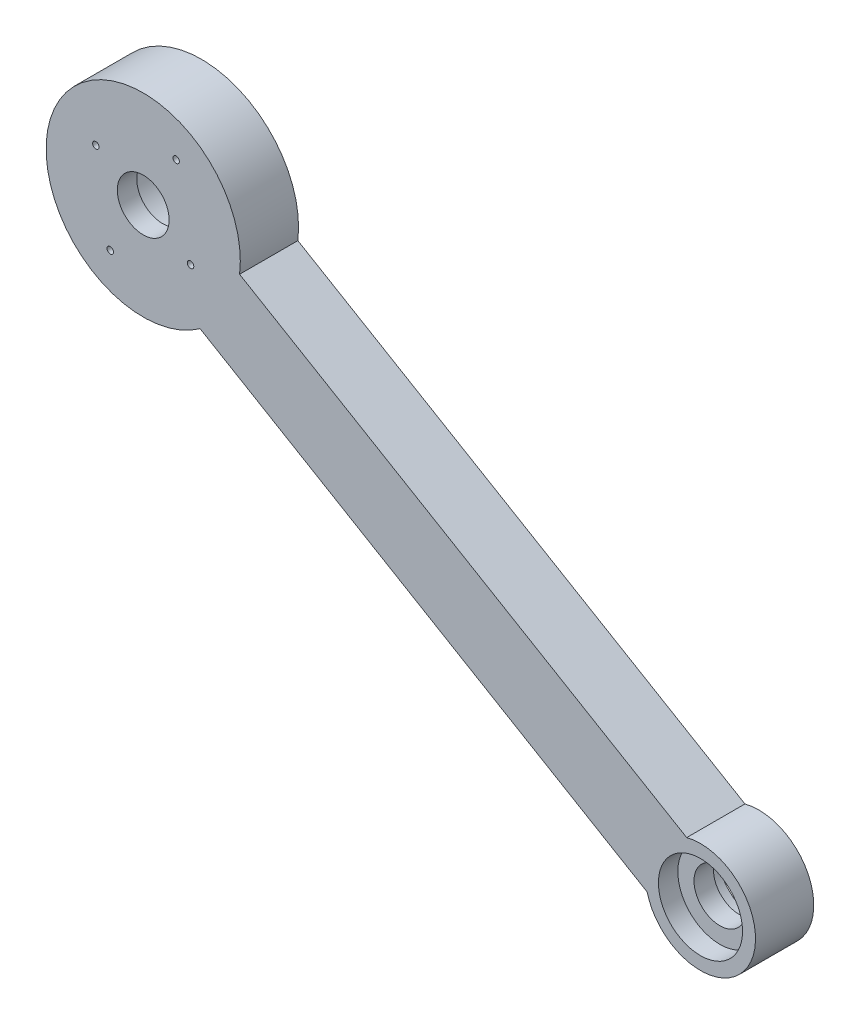
ISO-10303-21;
HEADER;
FILE_DESCRIPTION(('STEP AP214'),'2;1');
FILE_NAME('part.step','',(''),(''),'','','');
FILE_SCHEMA(('AUTOMOTIVE_DESIGN { 1 0 10303 214 1 1 1 1 }'));
ENDSEC;
DATA;
#1=APPLICATION_CONTEXT('core data for automotive mechanical design processes');
#2=APPLICATION_PROTOCOL_DEFINITION('international standard','automotive_design',2000,#1);
#3=PRODUCT_CONTEXT('',#1,'mechanical');
#4=PRODUCT('Part','Part','',(#3));
#5=PRODUCT_RELATED_PRODUCT_CATEGORY('part','',(#4));
#6=PRODUCT_DEFINITION_FORMATION('','',#4);
#7=PRODUCT_DEFINITION_CONTEXT('part definition',#1,'design');
#8=PRODUCT_DEFINITION('design','',#6,#7);
#9=PRODUCT_DEFINITION_SHAPE('','',#8);
#10=(LENGTH_UNIT() NAMED_UNIT(*) SI_UNIT(.MILLI.,.METRE.));
#11=(NAMED_UNIT(*) PLANE_ANGLE_UNIT() SI_UNIT($,.RADIAN.));
#12=(NAMED_UNIT(*) SI_UNIT($,.STERADIAN.) SOLID_ANGLE_UNIT());
#13=UNCERTAINTY_MEASURE_WITH_UNIT(LENGTH_MEASURE(1.E-05),#10,'distance_accuracy_value','');
#14=(GEOMETRIC_REPRESENTATION_CONTEXT(3) GLOBAL_UNCERTAINTY_ASSIGNED_CONTEXT((#13)) GLOBAL_UNIT_ASSIGNED_CONTEXT((#10,
#11,#12)) REPRESENTATION_CONTEXT('',''));
#15=CARTESIAN_POINT('',(0.,0.,0.));
#16=DIRECTION('',(0.,0.,1.));
#17=DIRECTION('',(1.,0.,0.));
#18=AXIS2_PLACEMENT_3D('',#15,#16,#17);
#19=CARTESIAN_POINT('',(79.4021009259185,-60.110986977048,4.5000000000001));
#20=DIRECTION('',(0.,0.,-1.));
#21=DIRECTION('',(0.,1.,0.));
#22=AXIS2_PLACEMENT_3D('',#19,#20,#21);
#23=CYLINDRICAL_SURFACE('',#22,6.49999999999999);
#24=CARTESIAN_POINT('',(79.4021009259185,-60.110986977048,-4.49999999999989));
#25=DIRECTION('',(0.,0.,1.));
#26=DIRECTION('',(0.,-1.,0.));
#27=AXIS2_PLACEMENT_3D('',#24,#25,#26);
#28=CIRCLE('',#27,6.49999999999999);
#29=CARTESIAN_POINT('',(79.4021009259185,-66.610986977048,-4.4999999999999));
#30=VERTEX_POINT('',#29);
#31=EDGE_CURVE('E228',#30,#30,#28,.T.);
#32=ORIENTED_EDGE('',*,*,#31,.F.);
#33=EDGE_LOOP('',(#32));
#34=FACE_BOUND('',#33,.T.);
#35=CARTESIAN_POINT('',(79.4021009259185,-60.110986977048,-1.49999999999989));
#36=DIRECTION('',(0.,0.,1.));
#37=DIRECTION('',(0.,-1.,0.));
#38=AXIS2_PLACEMENT_3D('',#35,#36,#37);
#39=CIRCLE('',#38,6.49999999999999);
#40=CARTESIAN_POINT('',(79.4021009259185,-66.610986977048,-1.4999999999999));
#41=VERTEX_POINT('',#40);
#42=EDGE_CURVE('E246',#41,#41,#39,.T.);
#43=ORIENTED_EDGE('',*,*,#42,.T.);
#44=EDGE_LOOP('',(#43));
#45=FACE_BOUND('',#44,.T.);
#46=ADVANCED_FACE('F59',(#34,#45),#23,.F.);
#47=CARTESIAN_POINT('',(-6.68402934790152,-9.22701922217562,4.50000000000011));
#48=DIRECTION('',(0.,0.,-1.));
#49=DIRECTION('',(0.,1.,0.));
#50=AXIS2_PLACEMENT_3D('',#47,#48,#49);
#51=CYLINDRICAL_SURFACE('',#50,6.49999999999999);
#52=CARTESIAN_POINT('',(-6.68402934790152,-9.22701922217561,-4.49999999999989));
#53=DIRECTION('',(0.,0.,1.));
#54=DIRECTION('',(0.,-1.,0.));
#55=AXIS2_PLACEMENT_3D('',#52,#53,#54);
#56=CIRCLE('',#55,6.49999999999999);
#57=CARTESIAN_POINT('',(-6.68402934790152,-15.7270192221756,-4.49999999999989));
#58=VERTEX_POINT('',#57);
#59=EDGE_CURVE('E148',#58,#58,#56,.T.);
#60=ORIENTED_EDGE('',*,*,#59,.F.);
#61=EDGE_LOOP('',(#60));
#62=FACE_BOUND('',#61,.T.);
#63=CARTESIAN_POINT('',(-6.68402934790152,-9.22701922217561,1.50000000000011));
#64=DIRECTION('',(0.,0.,1.));
#65=DIRECTION('',(0.,-1.,0.));
#66=AXIS2_PLACEMENT_3D('',#63,#64,#65);
#67=CIRCLE('',#66,6.49999999999999);
#68=CARTESIAN_POINT('',(-6.68402934790152,-15.7270192221756,1.50000000000011));
#69=VERTEX_POINT('',#68);
#70=EDGE_CURVE('E226',#69,#69,#67,.T.);
#71=ORIENTED_EDGE('',*,*,#70,.T.);
#72=EDGE_LOOP('',(#71));
#73=FACE_BOUND('',#72,.T.);
#74=ADVANCED_FACE('F186',(#62,#73),#51,.F.);
#75=CARTESIAN_POINT('',(0.,0.,4.50000000000011));
#76=DIRECTION('',(0.,0.,1.));
#77=DIRECTION('',(0.,-1.,0.));
#78=AXIS2_PLACEMENT_3D('',#75,#76,#77);
#79=PLANE('',#78);
#80=CARTESIAN_POINT('',(-11.7724261233886,-17.8356322495575,4.50000000000011));
#81=DIRECTION('',(0.,0.,1.));
#82=DIRECTION('',(0.,-1.,0.));
#83=AXIS2_PLACEMENT_3D('',#80,#81,#82);
#84=CIRCLE('',#83,0.500000000000026);
#85=CARTESIAN_POINT('',(-11.7724261233886,-18.3356322495576,4.50000000000011));
#86=VERTEX_POINT('',#85);
#87=EDGE_CURVE('E137',#86,#86,#84,.F.);
#88=ORIENTED_EDGE('',*,*,#87,.T.);
#89=EDGE_LOOP('',(#88));
#90=FACE_BOUND('',#89,.T.);
#91=CARTESIAN_POINT('',(-1.59563257241419,-0.618406194793586,4.50000000000011));
#92=DIRECTION('',(0.,0.,1.));
#93=DIRECTION('',(0.,-1.,0.));
#94=AXIS2_PLACEMENT_3D('',#91,#92,#93);
#95=CIRCLE('',#94,0.499999999999975);
#96=CARTESIAN_POINT('',(-1.59563257241419,-1.11840619479356,4.50000000000011));
#97=VERTEX_POINT('',#96);
#98=EDGE_CURVE('E134',#97,#97,#95,.T.);
#99=ORIENTED_EDGE('',*,*,#98,.F.);
#100=EDGE_LOOP('',(#99));
#101=FACE_BOUND('',#100,.T.);
#102=CARTESIAN_POINT('',(0.633291725373242,-13.5521564813397,4.50000000000011));
#103=DIRECTION('',(0.,0.,1.));
#104=DIRECTION('',(0.,-1.,0.));
#105=AXIS2_PLACEMENT_3D('',#102,#103,#104);
#106=CIRCLE('',#105,0.500000000000026);
#107=CARTESIAN_POINT('',(0.633291725373242,-14.0521564813397,4.50000000000011));
#108=VERTEX_POINT('',#107);
#109=EDGE_CURVE('E131',#108,#108,#106,.T.);
#110=ORIENTED_EDGE('',*,*,#109,.F.);
#111=EDGE_LOOP('',(#110));
#112=FACE_BOUND('',#111,.T.);
#113=CARTESIAN_POINT('',(-14.0013504211761,-4.90188196301145,4.50000000000011));
#114=DIRECTION('',(0.,0.,1.));
#115=DIRECTION('',(0.,-1.,0.));
#116=AXIS2_PLACEMENT_3D('',#113,#114,#115);
#117=CIRCLE('',#116,0.500000000000026);
#118=CARTESIAN_POINT('',(-14.0013504211761,-5.40188196301147,4.50000000000011));
#119=VERTEX_POINT('',#118);
#120=EDGE_CURVE('E128',#119,#119,#117,.F.);
#121=ORIENTED_EDGE('',*,*,#120,.T.);
#122=EDGE_LOOP('',(#121));
#123=FACE_BOUND('',#122,.T.);
#124=DIRECTION('',(0.860861302738201,-0.508839677548722,0.));
#125=VECTOR('',#124,1.);
#126=CARTESIAN_POINT('',(-2.7193833026163,-4.60068653414046,4.50000000000011));
#127=LINE('',#126,#125);
#128=CARTESIAN_POINT('',(8.20389496535909,-11.0572404226382,4.50000000000011));
#129=VERTEX_POINT('',#128);
#130=CARTESIAN_POINT('',(77.2720675931386,-51.8821986092961,4.50000000000011));
#131=VERTEX_POINT('',#130);
#132=EDGE_CURVE('E121',#129,#131,#127,.T.);
#133=ORIENTED_EDGE('',*,*,#132,.F.);
#134=CARTESIAN_POINT('',(-6.68402934790152,-9.22701922217562,4.50000000000011));
#135=DIRECTION('',(0.,0.,1.));
#136=DIRECTION('',(0.,-1.,0.));
#137=AXIS2_PLACEMENT_3D('',#134,#135,#136);
#138=CIRCLE('',#137,15.);
#139=CARTESIAN_POINT('',(2.09781883477449,-21.3875760554966,4.50000000000011));
#140=VERTEX_POINT('',#139);
#141=EDGE_CURVE('E111',#140,#129,#138,.F.);
#142=ORIENTED_EDGE('',*,*,#141,.F.);
#143=DIRECTION('',(0.860861302738201,-0.508839677548723,0.));
#144=VECTOR('',#143,1.);
#145=CARTESIAN_POINT('',(-8.82545943320096,-14.9310221669988,4.50000000000011));
#146=LINE('',#145,#144);
#147=CARTESIAN_POINT('',(71.1659914625539,-62.2125342421545,4.5000000000001));
#148=VERTEX_POINT('',#147);
#149=EDGE_CURVE('E116',#140,#148,#146,.T.);
#150=ORIENTED_EDGE('',*,*,#149,.T.);
#151=CARTESIAN_POINT('',(79.4021009259185,-60.110986977048,4.5000000000001));
#152=DIRECTION('',(0.,0.,1.));
#153=DIRECTION('',(0.,-1.,0.));
#154=AXIS2_PLACEMENT_3D('',#151,#152,#153);
#155=CIRCLE('',#154,8.50000000000004);
#156=EDGE_CURVE('E76',#148,#131,#155,.T.);
#157=ORIENTED_EDGE('',*,*,#156,.T.);
#158=EDGE_LOOP('',(#133,#142,#150,#157));
#159=FACE_BOUND('',#158,.T.);
#160=CARTESIAN_POINT('',(79.4021009259185,-60.110986977048,4.5000000000001));
#161=DIRECTION('',(0.,0.,1.));
#162=DIRECTION('',(0.,-1.,0.));
#163=AXIS2_PLACEMENT_3D('',#160,#161,#162);
#164=CIRCLE('',#163,6.49999999999999);
#165=CARTESIAN_POINT('',(79.4021009259185,-66.610986977048,4.5000000000001));
#166=VERTEX_POINT('',#165);
#167=EDGE_CURVE('E143',#166,#166,#164,.T.);
#168=ORIENTED_EDGE('',*,*,#167,.F.);
#169=EDGE_LOOP('',(#168));
#170=FACE_BOUND('',#169,.T.);
#171=CARTESIAN_POINT('',(-6.68402934790152,-9.22701922217561,4.50000000000011));
#172=DIRECTION('',(0.,0.,1.));
#173=DIRECTION('',(0.,-1.,0.));
#174=AXIS2_PLACEMENT_3D('',#171,#172,#173);
#175=CIRCLE('',#174,4.00000000000003);
#176=CARTESIAN_POINT('',(-6.68402934790152,-13.2270192221756,4.50000000000011));
#177=VERTEX_POINT('',#176);
#178=EDGE_CURVE('E233',#177,#177,#175,.T.);
#179=ORIENTED_EDGE('',*,*,#178,.F.);
#180=EDGE_LOOP('',(#179));
#181=FACE_BOUND('',#180,.T.);
#182=ADVANCED_FACE('F119',(#90,#101,#112,#123,#159,#170,#181),#79,.T.);
#183=CARTESIAN_POINT('',(0.,0.,-4.49999999999989));
#184=DIRECTION('',(0.,0.,1.));
#185=DIRECTION('',(0.,-1.,0.));
#186=AXIS2_PLACEMENT_3D('',#183,#184,#185);
#187=PLANE('',#186);
#188=CARTESIAN_POINT('',(-11.7724261233886,-17.8356322495575,-4.49999999999989));
#189=DIRECTION('',(0.,0.,1.));
#190=DIRECTION('',(0.,-1.,0.));
#191=AXIS2_PLACEMENT_3D('',#188,#189,#190);
#192=CIRCLE('',#191,0.500000000000026);
#193=CARTESIAN_POINT('',(-11.7724261233886,-18.3356322495576,-4.49999999999989));
#194=VERTEX_POINT('',#193);
#195=EDGE_CURVE('E123',#194,#194,#192,.F.);
#196=ORIENTED_EDGE('',*,*,#195,.F.);
#197=EDGE_LOOP('',(#196));
#198=FACE_BOUND('',#197,.T.);
#199=CARTESIAN_POINT('',(-1.59563257241418,-0.618406194793585,-4.49999999999989));
#200=DIRECTION('',(0.,0.,1.));
#201=DIRECTION('',(0.,-1.,0.));
#202=AXIS2_PLACEMENT_3D('',#199,#200,#201);
#203=CIRCLE('',#202,0.499999999999975);
#204=CARTESIAN_POINT('',(-1.59563257241418,-1.11840619479356,-4.49999999999989));
#205=VERTEX_POINT('',#204);
#206=EDGE_CURVE('E157',#205,#205,#203,.T.);
#207=ORIENTED_EDGE('',*,*,#206,.T.);
#208=EDGE_LOOP('',(#207));
#209=FACE_BOUND('',#208,.T.);
#210=CARTESIAN_POINT('',(0.633291725373242,-13.5521564813397,-4.49999999999989));
#211=DIRECTION('',(0.,0.,1.));
#212=DIRECTION('',(0.,-1.,0.));
#213=AXIS2_PLACEMENT_3D('',#210,#211,#212);
#214=CIRCLE('',#213,0.500000000000026);
#215=CARTESIAN_POINT('',(0.633291725373242,-14.0521564813397,-4.49999999999989));
#216=VERTEX_POINT('',#215);
#217=EDGE_CURVE('E154',#216,#216,#214,.T.);
#218=ORIENTED_EDGE('',*,*,#217,.T.);
#219=EDGE_LOOP('',(#218));
#220=FACE_BOUND('',#219,.T.);
#221=CARTESIAN_POINT('',(-14.0013504211761,-4.90188196301144,-4.49999999999989));
#222=DIRECTION('',(0.,0.,1.));
#223=DIRECTION('',(0.,-1.,0.));
#224=AXIS2_PLACEMENT_3D('',#221,#222,#223);
#225=CIRCLE('',#224,0.500000000000026);
#226=CARTESIAN_POINT('',(-14.0013504211761,-5.40188196301147,-4.49999999999989));
#227=VERTEX_POINT('',#226);
#228=EDGE_CURVE('E151',#227,#227,#225,.F.);
#229=ORIENTED_EDGE('',*,*,#228,.F.);
#230=EDGE_LOOP('',(#229));
#231=FACE_BOUND('',#230,.T.);
#232=ORIENTED_EDGE('',*,*,#59,.T.);
#233=EDGE_LOOP('',(#232));
#234=FACE_BOUND('',#233,.T.);
#235=DIRECTION('',(0.860861302738201,-0.508839677548722,0.));
#236=VECTOR('',#235,1.);
#237=CARTESIAN_POINT('',(-2.7193833026163,-4.60068653414046,-4.49999999999989));
#238=LINE('',#237,#236);
#239=CARTESIAN_POINT('',(8.20389496535909,-11.0572404226382,-4.49999999999989));
#240=VERTEX_POINT('',#239);
#241=CARTESIAN_POINT('',(77.2720675931386,-51.8821986092961,-4.49999999999989));
#242=VERTEX_POINT('',#241);
#243=EDGE_CURVE('E140',#240,#242,#238,.T.);
#244=ORIENTED_EDGE('',*,*,#243,.T.);
#245=CARTESIAN_POINT('',(79.4021009259185,-60.110986977048,-4.49999999999989));
#246=DIRECTION('',(0.,0.,1.));
#247=DIRECTION('',(0.,-1.,0.));
#248=AXIS2_PLACEMENT_3D('',#245,#246,#247);
#249=CIRCLE('',#248,8.50000000000004);
#250=CARTESIAN_POINT('',(71.1659914625539,-62.2125342421545,-4.49999999999989));
#251=VERTEX_POINT('',#250);
#252=EDGE_CURVE('E146',#251,#242,#249,.T.);
#253=ORIENTED_EDGE('',*,*,#252,.F.);
#254=DIRECTION('',(0.860861302738201,-0.508839677548723,0.));
#255=VECTOR('',#254,1.);
#256=CARTESIAN_POINT('',(-8.82545943320096,-14.9310221669988,-4.49999999999989));
#257=LINE('',#256,#255);
#258=CARTESIAN_POINT('',(2.09781883477449,-21.3875760554966,-4.49999999999989));
#259=VERTEX_POINT('',#258);
#260=EDGE_CURVE('E92',#259,#251,#257,.T.);
#261=ORIENTED_EDGE('',*,*,#260,.F.);
#262=CARTESIAN_POINT('',(-6.68402934790152,-9.22701922217561,-4.49999999999989));
#263=DIRECTION('',(0.,0.,1.));
#264=DIRECTION('',(0.,-1.,0.));
#265=AXIS2_PLACEMENT_3D('',#262,#263,#264);
#266=CIRCLE('',#265,15.);
#267=EDGE_CURVE('E113',#259,#240,#266,.F.);
#268=ORIENTED_EDGE('',*,*,#267,.T.);
#269=EDGE_LOOP('',(#244,#253,#261,#268));
#270=FACE_BOUND('',#269,.T.);
#271=ORIENTED_EDGE('',*,*,#31,.T.);
#272=EDGE_LOOP('',(#271));
#273=FACE_BOUND('',#272,.T.);
#274=ADVANCED_FACE('F165',(#198,#209,#220,#231,#234,#270,#273),#187,.F.);
#275=CARTESIAN_POINT('',(-2.7193833026163,-4.60068653414046,4.50000000000011));
#276=DIRECTION('',(0.508839677548721,0.860861302738201,0.));
#277=DIRECTION('',(-0.860861302738201,0.508839677548722,0.));
#278=AXIS2_PLACEMENT_3D('',#275,#276,#277);
#279=PLANE('',#278);
#280=ORIENTED_EDGE('',*,*,#243,.F.);
#281=DIRECTION('',(0.,0.,-1.));
#282=VECTOR('',#281,1.);
#283=CARTESIAN_POINT('',(8.20389496535909,-11.0572404226382,4.50000000000011));
#284=LINE('',#283,#282);
#285=EDGE_CURVE('E68',#129,#240,#284,.T.);
#286=ORIENTED_EDGE('',*,*,#285,.F.);
#287=ORIENTED_EDGE('',*,*,#132,.T.);
#288=DIRECTION('',(0.,0.,-1.));
#289=VECTOR('',#288,1.);
#290=CARTESIAN_POINT('',(77.2720675931386,-51.8821986092961,4.50000000000011));
#291=LINE('',#290,#289);
#292=EDGE_CURVE('E99',#131,#242,#291,.T.);
#293=ORIENTED_EDGE('',*,*,#292,.T.);
#294=EDGE_LOOP('',(#280,#286,#287,#293));
#295=FACE_BOUND('',#294,.T.);
#296=ADVANCED_FACE('F61',(#295),#279,.T.);
#297=CARTESIAN_POINT('',(-6.68402934790152,-9.22701922217562,4.50000000000011));
#298=DIRECTION('',(0.,0.,-1.));
#299=DIRECTION('',(0.,1.,0.));
#300=AXIS2_PLACEMENT_3D('',#297,#298,#299);
#301=CYLINDRICAL_SURFACE('',#300,15.);
#302=ORIENTED_EDGE('',*,*,#267,.F.);
#303=DIRECTION('',(0.,0.,-1.));
#304=VECTOR('',#303,1.);
#305=CARTESIAN_POINT('',(2.09781883477449,-21.3875760554966,4.50000000000011));
#306=LINE('',#305,#304);
#307=EDGE_CURVE('E107',#140,#259,#306,.T.);
#308=ORIENTED_EDGE('',*,*,#307,.F.);
#309=ORIENTED_EDGE('',*,*,#141,.T.);
#310=ORIENTED_EDGE('',*,*,#285,.T.);
#311=EDGE_LOOP('',(#302,#308,#309,#310));
#312=FACE_BOUND('',#311,.T.);
#313=ADVANCED_FACE('F109',(#312),#301,.T.);
#314=CARTESIAN_POINT('',(-8.82545943320096,-14.9310221669988,4.50000000000011));
#315=DIRECTION('',(0.508839677548723,0.8608613027382,0.));
#316=DIRECTION('',(-0.860861302738201,0.508839677548723,0.));
#317=AXIS2_PLACEMENT_3D('',#314,#315,#316);
#318=PLANE('',#317);
#319=ORIENTED_EDGE('',*,*,#260,.T.);
#320=DIRECTION('',(0.,0.,-1.));
#321=VECTOR('',#320,1.);
#322=CARTESIAN_POINT('',(71.1659914625539,-62.2125342421545,4.5000000000001));
#323=LINE('',#322,#321);
#324=EDGE_CURVE('E114',#148,#251,#323,.T.);
#325=ORIENTED_EDGE('',*,*,#324,.F.);
#326=ORIENTED_EDGE('',*,*,#149,.F.);
#327=ORIENTED_EDGE('',*,*,#307,.T.);
#328=EDGE_LOOP('',(#319,#325,#326,#327));
#329=FACE_BOUND('',#328,.T.);
#330=ADVANCED_FACE('F117',(#329),#318,.F.);
#331=CARTESIAN_POINT('',(-11.7724261233886,-17.8356322495575,4.50000000000011));
#332=DIRECTION('',(0.,0.,-1.));
#333=DIRECTION('',(0.,1.,0.));
#334=AXIS2_PLACEMENT_3D('',#331,#332,#333);
#335=CYLINDRICAL_SURFACE('',#334,0.500000000000026);
#336=ORIENTED_EDGE('',*,*,#87,.F.);
#337=EDGE_LOOP('',(#336));
#338=FACE_BOUND('',#337,.T.);
#339=ORIENTED_EDGE('',*,*,#195,.T.);
#340=EDGE_LOOP('',(#339));
#341=FACE_BOUND('',#340,.T.);
#342=ADVANCED_FACE('F203',(#338,#341),#335,.F.);
#343=CARTESIAN_POINT('',(-1.59563257241419,-0.618406194793586,4.50000000000011));
#344=DIRECTION('',(0.,0.,-1.));
#345=DIRECTION('',(0.,1.,0.));
#346=AXIS2_PLACEMENT_3D('',#343,#344,#345);
#347=CYLINDRICAL_SURFACE('',#346,0.499999999999975);
#348=ORIENTED_EDGE('',*,*,#98,.T.);
#349=EDGE_LOOP('',(#348));
#350=FACE_BOUND('',#349,.T.);
#351=ORIENTED_EDGE('',*,*,#206,.F.);
#352=EDGE_LOOP('',(#351));
#353=FACE_BOUND('',#352,.T.);
#354=ADVANCED_FACE('F206',(#350,#353),#347,.F.);
#355=CARTESIAN_POINT('',(0.633291725373242,-13.5521564813397,4.50000000000011));
#356=DIRECTION('',(0.,0.,-1.));
#357=DIRECTION('',(0.,1.,0.));
#358=AXIS2_PLACEMENT_3D('',#355,#356,#357);
#359=CYLINDRICAL_SURFACE('',#358,0.500000000000026);
#360=ORIENTED_EDGE('',*,*,#109,.T.);
#361=EDGE_LOOP('',(#360));
#362=FACE_BOUND('',#361,.T.);
#363=ORIENTED_EDGE('',*,*,#217,.F.);
#364=EDGE_LOOP('',(#363));
#365=FACE_BOUND('',#364,.T.);
#366=ADVANCED_FACE('F180',(#362,#365),#359,.F.);
#367=CARTESIAN_POINT('',(-14.0013504211761,-4.90188196301145,4.50000000000011));
#368=DIRECTION('',(0.,0.,-1.));
#369=DIRECTION('',(0.,1.,0.));
#370=AXIS2_PLACEMENT_3D('',#367,#368,#369);
#371=CYLINDRICAL_SURFACE('',#370,0.500000000000026);
#372=ORIENTED_EDGE('',*,*,#120,.F.);
#373=EDGE_LOOP('',(#372));
#374=FACE_BOUND('',#373,.T.);
#375=ORIENTED_EDGE('',*,*,#228,.T.);
#376=EDGE_LOOP('',(#375));
#377=FACE_BOUND('',#376,.T.);
#378=ADVANCED_FACE('F171',(#374,#377),#371,.F.);
#379=CARTESIAN_POINT('',(79.4021009259185,-60.110986977048,4.5000000000001));
#380=DIRECTION('',(0.,0.,-1.));
#381=DIRECTION('',(0.,1.,0.));
#382=AXIS2_PLACEMENT_3D('',#379,#380,#381);
#383=CYLINDRICAL_SURFACE('',#382,8.50000000000004);
#384=ORIENTED_EDGE('',*,*,#252,.T.);
#385=ORIENTED_EDGE('',*,*,#292,.F.);
#386=ORIENTED_EDGE('',*,*,#156,.F.);
#387=ORIENTED_EDGE('',*,*,#324,.T.);
#388=EDGE_LOOP('',(#384,#385,#386,#387));
#389=FACE_BOUND('',#388,.T.);
#390=ADVANCED_FACE('F168',(#389),#383,.T.);
#391=CARTESIAN_POINT('',(79.4021009259185,-60.110986977048,1.50000000000011));
#392=DIRECTION('',(0.,0.,1.));
#393=DIRECTION('',(0.,-1.,0.));
#394=AXIS2_PLACEMENT_3D('',#391,#392,#393);
#395=CIRCLE('',#394,6.49999999999999);
#396=CARTESIAN_POINT('',(79.4021009259185,-66.610986977048,1.50000000000011));
#397=VERTEX_POINT('',#396);
#398=EDGE_CURVE('E12',#397,#397,#395,.T.);
#399=ORIENTED_EDGE('',*,*,#398,.F.);
#400=EDGE_LOOP('',(#399));
#401=FACE_BOUND('',#400,.T.);
#402=ORIENTED_EDGE('',*,*,#167,.T.);
#403=EDGE_LOOP('',(#402));
#404=FACE_BOUND('',#403,.T.);
#405=ADVANCED_FACE('F170',(#401,#404),#23,.F.);
#406=CARTESIAN_POINT('',(-6.68402934790152,-9.22701922217561,1.50000000000011));
#407=DIRECTION('',(0.,0.,1.));
#408=DIRECTION('',(0.,-1.,0.));
#409=AXIS2_PLACEMENT_3D('',#406,#407,#408);
#410=PLANE('',#409);
#411=CARTESIAN_POINT('',(-6.68402934790152,-9.22701922217561,1.50000000000011));
#412=DIRECTION('',(0.,0.,1.));
#413=DIRECTION('',(0.,-1.,0.));
#414=AXIS2_PLACEMENT_3D('',#411,#412,#413);
#415=CIRCLE('',#414,4.00000000000003);
#416=CARTESIAN_POINT('',(-6.68402934790152,-13.2270192221756,1.50000000000011));
#417=VERTEX_POINT('',#416);
#418=EDGE_CURVE('E229',#417,#417,#415,.T.);
#419=ORIENTED_EDGE('',*,*,#418,.T.);
#420=EDGE_LOOP('',(#419));
#421=FACE_BOUND('',#420,.T.);
#422=ORIENTED_EDGE('',*,*,#70,.F.);
#423=EDGE_LOOP('',(#422));
#424=FACE_BOUND('',#423,.T.);
#425=ADVANCED_FACE('F177',(#421,#424),#410,.F.);
#426=CARTESIAN_POINT('',(-6.68402934790152,-9.22701922217561,1.50000000000011));
#427=DIRECTION('',(0.,0.,1.));
#428=DIRECTION('',(0.,-1.,0.));
#429=AXIS2_PLACEMENT_3D('',#426,#427,#428);
#430=CYLINDRICAL_SURFACE('',#429,4.00000000000003);
#431=ORIENTED_EDGE('',*,*,#418,.F.);
#432=EDGE_LOOP('',(#431));
#433=FACE_BOUND('',#432,.T.);
#434=ORIENTED_EDGE('',*,*,#178,.T.);
#435=EDGE_LOOP('',(#434));
#436=FACE_BOUND('',#435,.T.);
#437=ADVANCED_FACE('F263',(#433,#436),#430,.F.);
#438=CARTESIAN_POINT('',(79.4021009259185,-60.110986977048,1.50000000000011));
#439=DIRECTION('',(0.,0.,-1.));
#440=DIRECTION('',(0.,1.,0.));
#441=AXIS2_PLACEMENT_3D('',#438,#439,#440);
#442=CYLINDRICAL_SURFACE('',#441,3.99999999999996);
#443=CARTESIAN_POINT('',(79.4021009259185,-60.110986977048,1.50000000000011));
#444=DIRECTION('',(0.,0.,1.));
#445=DIRECTION('',(0.,-1.,0.));
#446=AXIS2_PLACEMENT_3D('',#443,#444,#445);
#447=CIRCLE('',#446,3.99999999999996);
#448=CARTESIAN_POINT('',(79.4021009259185,-64.1109869770479,1.50000000000011));
#449=VERTEX_POINT('',#448);
#450=EDGE_CURVE('E244',#449,#449,#447,.T.);
#451=ORIENTED_EDGE('',*,*,#450,.T.);
#452=EDGE_LOOP('',(#451));
#453=FACE_BOUND('',#452,.T.);
#454=CARTESIAN_POINT('',(79.4021009259185,-60.110986977048,-1.49999999999989));
#455=DIRECTION('',(0.,0.,1.));
#456=DIRECTION('',(0.,-1.,0.));
#457=AXIS2_PLACEMENT_3D('',#454,#455,#456);
#458=CIRCLE('',#457,3.99999999999996);
#459=CARTESIAN_POINT('',(79.4021009259185,-64.1109869770479,-1.49999999999989));
#460=VERTEX_POINT('',#459);
#461=EDGE_CURVE('E251',#460,#460,#458,.T.);
#462=ORIENTED_EDGE('',*,*,#461,.F.);
#463=EDGE_LOOP('',(#462));
#464=FACE_BOUND('',#463,.T.);
#465=ADVANCED_FACE('F260',(#453,#464),#442,.F.);
#466=CARTESIAN_POINT('',(0.,0.,1.50000000000011));
#467=DIRECTION('',(0.,0.,1.));
#468=DIRECTION('',(0.,-1.,0.));
#469=AXIS2_PLACEMENT_3D('',#466,#467,#468);
#470=PLANE('',#469);
#471=ORIENTED_EDGE('',*,*,#450,.F.);
#472=EDGE_LOOP('',(#471));
#473=FACE_BOUND('',#472,.T.);
#474=ORIENTED_EDGE('',*,*,#398,.T.);
#475=EDGE_LOOP('',(#474));
#476=FACE_BOUND('',#475,.T.);
#477=ADVANCED_FACE('F262',(#473,#476),#470,.T.);
#478=CARTESIAN_POINT('',(0.,0.,-1.49999999999989));
#479=DIRECTION('',(0.,0.,1.));
#480=DIRECTION('',(0.,-1.,0.));
#481=AXIS2_PLACEMENT_3D('',#478,#479,#480);
#482=PLANE('',#481);
#483=ORIENTED_EDGE('',*,*,#461,.T.);
#484=EDGE_LOOP('',(#483));
#485=FACE_BOUND('',#484,.T.);
#486=ORIENTED_EDGE('',*,*,#42,.F.);
#487=EDGE_LOOP('',(#486));
#488=FACE_BOUND('',#487,.T.);
#489=ADVANCED_FACE('F257',(#485,#488),#482,.F.);
#490=CLOSED_SHELL('',(#46,#74,#182,#274,#296,#313,#330,#342,#354,#366,#378,#390,#405,#425,#437,
#465,#477,#489));
#491=MANIFOLD_SOLID_BREP('B2',#490);
#492=ADVANCED_BREP_SHAPE_REPRESENTATION('',(#18,#491),#14);
#493=SHAPE_DEFINITION_REPRESENTATION(#9,#492);
ENDSEC;
END-ISO-10303-21;
